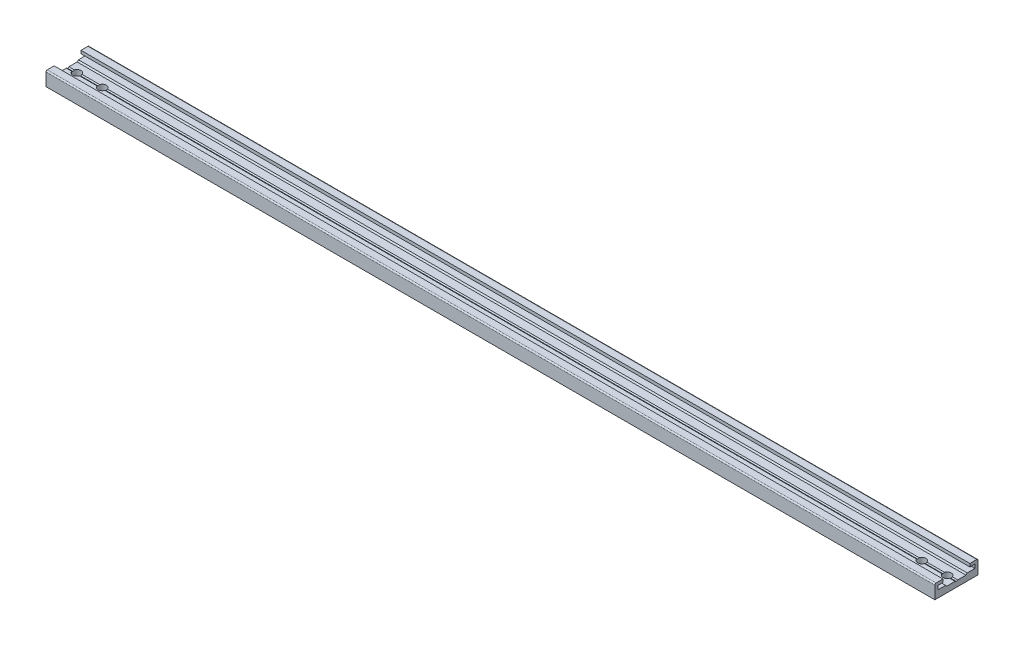
ISO-10303-21;
HEADER;
FILE_DESCRIPTION(('STEP AP214'),'2;1');
FILE_NAME('part.step','',(''),(''),'','','');
FILE_SCHEMA(('AUTOMOTIVE_DESIGN { 1 0 10303 214 1 1 1 1 }'));
ENDSEC;
DATA;
#1=APPLICATION_CONTEXT('core data for automotive mechanical design processes');
#2=APPLICATION_PROTOCOL_DEFINITION('international standard','automotive_design',2000,#1);
#3=PRODUCT_CONTEXT('',#1,'mechanical');
#4=PRODUCT('Part','Part','',(#3));
#5=PRODUCT_RELATED_PRODUCT_CATEGORY('part','',(#4));
#6=PRODUCT_DEFINITION_FORMATION('','',#4);
#7=PRODUCT_DEFINITION_CONTEXT('part definition',#1,'design');
#8=PRODUCT_DEFINITION('design','',#6,#7);
#9=PRODUCT_DEFINITION_SHAPE('','',#8);
#10=(LENGTH_UNIT() NAMED_UNIT(*) SI_UNIT(.MILLI.,.METRE.));
#11=(NAMED_UNIT(*) PLANE_ANGLE_UNIT() SI_UNIT($,.RADIAN.));
#12=(NAMED_UNIT(*) SI_UNIT($,.STERADIAN.) SOLID_ANGLE_UNIT());
#13=UNCERTAINTY_MEASURE_WITH_UNIT(LENGTH_MEASURE(1.E-05),#10,'distance_accuracy_value','');
#14=(GEOMETRIC_REPRESENTATION_CONTEXT(3) GLOBAL_UNCERTAINTY_ASSIGNED_CONTEXT((#13)) GLOBAL_UNIT_ASSIGNED_CONTEXT((#10,
#11,#12)) REPRESENTATION_CONTEXT('',''));
#15=CARTESIAN_POINT('',(0.,0.,0.));
#16=DIRECTION('',(0.,0.,1.));
#17=DIRECTION('',(1.,0.,0.));
#18=AXIS2_PLACEMENT_3D('',#15,#16,#17);
#19=CARTESIAN_POINT('',(350.,-0.45,-0.499999998010386));
#20=DIRECTION('',(0.,-0.866025403784438,-0.500000000000001));
#21=DIRECTION('',(0.,0.500000000000001,-0.866025403784438));
#22=AXIS2_PLACEMENT_3D('',#19,#20,#21);
#23=PLANE('',#22);
#24=DIRECTION('',(-1.,0.,0.));
#25=VECTOR('',#24,1.);
#26=CARTESIAN_POINT('',(350.,-0.45,-0.499999998010386));
#27=LINE('',#26,#25);
#28=CARTESIAN_POINT('',(12.1276315787002,-0.45,-0.499999998010386));
#29=VERTEX_POINT('',#28);
#30=CARTESIAN_POINT('',(5.16736841334154,-0.45,-0.499999998010386));
#31=VERTEX_POINT('',#30);
#32=EDGE_CURVE('E690',#29,#31,#27,.T.);
#33=ORIENTED_EDGE('',*,*,#32,.T.);
#34=CARTESIAN_POINT('',(3.64749999602086,-0.738675131148674,-3.97927575479489E-09));
#35=DIRECTION('',(0.,-0.866025403784438,-0.500000000000001));
#36=DIRECTION('',(0.,0.500000000000001,-0.866025403784438));
#37=AXIS2_PLACEMENT_3D('',#34,#35,#36);
#38=ELLIPSE('',#37,1.8475208614068,1.6);
#39=CARTESIAN_POINT('',(5.24749999602103,-0.738675133446109,0.));
#40=VERTEX_POINT('',#39);
#41=EDGE_CURVE('E444',#31,#40,#38,.T.);
#42=ORIENTED_EDGE('',*,*,#41,.T.);
#43=DIRECTION('',(-1.,0.,0.));
#44=VECTOR('',#43,1.);
#45=CARTESIAN_POINT('',(350.,-0.738675133446109,0.));
#46=LINE('',#45,#44);
#47=CARTESIAN_POINT('',(12.0474999960211,-0.738675133446109,0.));
#48=VERTEX_POINT('',#47);
#49=EDGE_CURVE('E667',#48,#40,#46,.T.);
#50=ORIENTED_EDGE('',*,*,#49,.F.);
#51=CARTESIAN_POINT('',(13.6474999960209,-0.738675131148674,-3.97927453014809E-09));
#52=DIRECTION('',(0.,-0.866025403784438,-0.500000000000001));
#53=DIRECTION('',(0.,0.500000000000001,-0.866025403784438));
#54=AXIS2_PLACEMENT_3D('',#51,#52,#53);
#55=ELLIPSE('',#54,1.84752086140681,1.6);
#56=EDGE_CURVE('E415',#48,#29,#55,.T.);
#57=ORIENTED_EDGE('',*,*,#56,.T.);
#58=EDGE_LOOP('',(#33,#42,#50,#57));
#59=FACE_BOUND('',#58,.T.);
#60=ADVANCED_FACE('F39',(#59),#23,.F.);
#61=CARTESIAN_POINT('',(350.,-0.45,-0.499999998010386));
#62=VERTEX_POINT('',#61);
#63=CARTESIAN_POINT('',(347.8723684213,-0.45,-0.499999998010386));
#64=VERTEX_POINT('',#63);
#65=EDGE_CURVE('E350',#62,#64,#27,.T.);
#66=ORIENTED_EDGE('',*,*,#65,.T.);
#67=CARTESIAN_POINT('',(346.352500003979,-0.738675131148699,-3.97923215399124E-09));
#68=DIRECTION('',(0.,-0.866025403784438,-0.500000000000001));
#69=DIRECTION('',(0.,0.500000000000001,-0.866025403784438));
#70=AXIS2_PLACEMENT_3D('',#67,#68,#69);
#71=ELLIPSE('',#70,1.84752086140676,1.59999999999996);
#72=CARTESIAN_POINT('',(347.952500003979,-0.738675133446109,0.));
#73=VERTEX_POINT('',#72);
#74=EDGE_CURVE('E434',#64,#73,#71,.T.);
#75=ORIENTED_EDGE('',*,*,#74,.T.);
#76=CARTESIAN_POINT('',(350.,-0.738675133446109,0.));
#77=VERTEX_POINT('',#76);
#78=EDGE_CURVE('E345',#77,#73,#46,.T.);
#79=ORIENTED_EDGE('',*,*,#78,.F.);
#80=DIRECTION('',(0.,-0.500000000000001,0.866025403784438));
#81=VECTOR('',#80,1.);
#82=CARTESIAN_POINT('',(350.,-0.45,-0.499999998010386));
#83=LINE('',#82,#81);
#84=EDGE_CURVE('E483',#62,#77,#83,.T.);
#85=ORIENTED_EDGE('',*,*,#84,.F.);
#86=EDGE_LOOP('',(#66,#75,#79,#85));
#87=FACE_BOUND('',#86,.T.);
#88=ADVANCED_FACE('F632',(#87),#23,.F.);
#89=CARTESIAN_POINT('',(344.752500003979,-0.738675133446109,0.));
#90=VERTEX_POINT('',#89);
#91=CARTESIAN_POINT('',(337.952500003979,-0.738675133446109,0.));
#92=VERTEX_POINT('',#91);
#93=EDGE_CURVE('E349',#90,#92,#46,.T.);
#94=ORIENTED_EDGE('',*,*,#93,.F.);
#95=CARTESIAN_POINT('',(344.832631586659,-0.45,-0.499999998010386));
#96=VERTEX_POINT('',#95);
#97=EDGE_CURVE('E439',#90,#96,#71,.T.);
#98=ORIENTED_EDGE('',*,*,#97,.T.);
#99=CARTESIAN_POINT('',(337.8723684213,-0.45,-0.499999998010386));
#100=VERTEX_POINT('',#99);
#101=EDGE_CURVE('E354',#96,#100,#27,.T.);
#102=ORIENTED_EDGE('',*,*,#101,.T.);
#103=CARTESIAN_POINT('',(336.352500003979,-0.738675131148698,-3.97923337863804E-09));
#104=DIRECTION('',(0.,-0.866025403784438,-0.500000000000001));
#105=DIRECTION('',(0.,0.500000000000001,-0.866025403784438));
#106=AXIS2_PLACEMENT_3D('',#103,#104,#105);
#107=ELLIPSE('',#106,1.84752086140676,1.59999999999996);
#108=EDGE_CURVE('E414',#100,#92,#107,.T.);
#109=ORIENTED_EDGE('',*,*,#108,.T.);
#110=EDGE_LOOP('',(#94,#98,#102,#109));
#111=FACE_BOUND('',#110,.T.);
#112=ADVANCED_FACE('F688',(#111),#23,.F.);
#113=CARTESIAN_POINT('',(334.752500003979,-0.738675133446109,0.));
#114=VERTEX_POINT('',#113);
#115=CARTESIAN_POINT('',(15.247499996021,-0.738675133446109,0.));
#116=VERTEX_POINT('',#115);
#117=EDGE_CURVE('E322',#114,#116,#46,.T.);
#118=ORIENTED_EDGE('',*,*,#117,.F.);
#119=CARTESIAN_POINT('',(334.832631586659,-0.45,-0.499999998010386));
#120=VERTEX_POINT('',#119);
#121=EDGE_CURVE('E422',#114,#120,#107,.T.);
#122=ORIENTED_EDGE('',*,*,#121,.T.);
#123=CARTESIAN_POINT('',(15.1673684133415,-0.45,-0.499999998010386));
#124=VERTEX_POINT('',#123);
#125=EDGE_CURVE('E686',#120,#124,#27,.T.);
#126=ORIENTED_EDGE('',*,*,#125,.T.);
#127=EDGE_CURVE('E324',#124,#116,#55,.T.);
#128=ORIENTED_EDGE('',*,*,#127,.T.);
#129=EDGE_LOOP('',(#118,#122,#126,#128));
#130=FACE_BOUND('',#129,.T.);
#131=ADVANCED_FACE('F779',(#130),#23,.F.);
#132=CARTESIAN_POINT('',(350.,-0.45,0.499999998010387));
#133=DIRECTION('',(0.,-0.866025403784438,0.5));
#134=DIRECTION('',(0.,-0.5,-0.866025403784439));
#135=AXIS2_PLACEMENT_3D('',#132,#133,#134);
#136=PLANE('',#135);
#137=DIRECTION('',(-1.,0.,0.));
#138=VECTOR('',#137,1.);
#139=CARTESIAN_POINT('',(350.,-0.45,0.499999998010387));
#140=LINE('',#139,#138);
#141=CARTESIAN_POINT('',(2.12763158131835,-0.450000000000001,0.499999998010387));
#142=VERTEX_POINT('',#141);
#143=CARTESIAN_POINT('',(0.,-0.45,0.499999998010387));
#144=VERTEX_POINT('',#143);
#145=EDGE_CURVE('E338',#142,#144,#140,.T.);
#146=ORIENTED_EDGE('',*,*,#145,.F.);
#147=CARTESIAN_POINT('',(3.64749999602086,-0.738675135743546,-3.97927575479489E-09));
#148=DIRECTION('',(0.,-0.866025403784438,0.5));
#149=DIRECTION('',(0.,0.5,0.866025403784439));
#150=AXIS2_PLACEMENT_3D('',#147,#148,#149);
#151=ELLIPSE('',#150,1.8475208614068,1.6);
#152=CARTESIAN_POINT('',(2.04749999602105,-0.738675133446109,0.));
#153=VERTEX_POINT('',#152);
#154=EDGE_CURVE('E58',#142,#153,#151,.T.);
#155=ORIENTED_EDGE('',*,*,#154,.T.);
#156=CARTESIAN_POINT('',(0.,-0.738675133446109,0.));
#157=VERTEX_POINT('',#156);
#158=EDGE_CURVE('E342',#153,#157,#46,.T.);
#159=ORIENTED_EDGE('',*,*,#158,.T.);
#160=DIRECTION('',(0.,0.5,0.866025403784438));
#161=VECTOR('',#160,1.);
#162=CARTESIAN_POINT('',(0.,-0.45,0.499999998010387));
#163=LINE('',#162,#161);
#164=EDGE_CURVE('E543',#157,#144,#163,.T.);
#165=ORIENTED_EDGE('',*,*,#164,.T.);
#166=EDGE_LOOP('',(#146,#155,#159,#165));
#167=FACE_BOUND('',#166,.T.);
#168=ADVANCED_FACE('F610',(#167),#136,.F.);
#169=CARTESIAN_POINT('',(344.832631589277,-0.450000000000001,0.499999998010387));
#170=VERTEX_POINT('',#169);
#171=CARTESIAN_POINT('',(337.872368418682,-0.45,0.499999998010397));
#172=VERTEX_POINT('',#171);
#173=EDGE_CURVE('E331',#170,#172,#140,.T.);
#174=ORIENTED_EDGE('',*,*,#173,.F.);
#175=CARTESIAN_POINT('',(346.352500003979,-0.73867513574352,-3.97923215399124E-09));
#176=DIRECTION('',(0.,-0.866025403784438,0.5));
#177=DIRECTION('',(0.,0.5,0.866025403784439));
#178=AXIS2_PLACEMENT_3D('',#175,#176,#177);
#179=ELLIPSE('',#178,1.84752086140676,1.59999999999996);
#180=EDGE_CURVE('E408',#170,#90,#179,.T.);
#181=ORIENTED_EDGE('',*,*,#180,.T.);
#182=ORIENTED_EDGE('',*,*,#93,.T.);
#183=CARTESIAN_POINT('',(336.352500003979,-0.738675135743521,-3.97923337863804E-09));
#184=DIRECTION('',(0.,-0.866025403784438,0.5));
#185=DIRECTION('',(0.,0.5,0.866025403784439));
#186=AXIS2_PLACEMENT_3D('',#183,#184,#185);
#187=ELLIPSE('',#186,1.84752086140676,1.59999999999996);
#188=EDGE_CURVE('E410',#92,#172,#187,.T.);
#189=ORIENTED_EDGE('',*,*,#188,.T.);
#190=EDGE_LOOP('',(#174,#181,#182,#189));
#191=FACE_BOUND('',#190,.T.);
#192=ADVANCED_FACE('F406',(#191),#136,.F.);
#193=CARTESIAN_POINT('',(334.832631589277,-0.450000000000001,0.499999998010387));
#194=VERTEX_POINT('',#193);
#195=CARTESIAN_POINT('',(15.1673684107234,-0.45,0.499999998010386));
#196=VERTEX_POINT('',#195);
#197=EDGE_CURVE('E320',#194,#196,#140,.T.);
#198=ORIENTED_EDGE('',*,*,#197,.F.);
#199=EDGE_CURVE('E417',#194,#114,#187,.T.);
#200=ORIENTED_EDGE('',*,*,#199,.T.);
#201=ORIENTED_EDGE('',*,*,#117,.T.);
#202=CARTESIAN_POINT('',(13.6474999960209,-0.738675135743545,-3.97927453014809E-09));
#203=DIRECTION('',(0.,-0.866025403784438,0.5));
#204=DIRECTION('',(0.,0.5,0.866025403784439));
#205=AXIS2_PLACEMENT_3D('',#202,#203,#204);
#206=ELLIPSE('',#205,1.84752086140681,1.6);
#207=EDGE_CURVE('E305',#116,#196,#206,.T.);
#208=ORIENTED_EDGE('',*,*,#207,.T.);
#209=EDGE_LOOP('',(#198,#200,#201,#208));
#210=FACE_BOUND('',#209,.T.);
#211=ADVANCED_FACE('F318',(#210),#136,.F.);
#212=ORIENTED_EDGE('',*,*,#49,.T.);
#213=CARTESIAN_POINT('',(5.16736841072337,-0.45,0.499999998010387));
#214=VERTEX_POINT('',#213);
#215=EDGE_CURVE('E440',#40,#214,#151,.T.);
#216=ORIENTED_EDGE('',*,*,#215,.T.);
#217=CARTESIAN_POINT('',(12.1276315813183,-0.450000000000001,0.499999998010387));
#218=VERTEX_POINT('',#217);
#219=EDGE_CURVE('E332',#218,#214,#140,.T.);
#220=ORIENTED_EDGE('',*,*,#219,.F.);
#221=EDGE_CURVE('E68',#218,#48,#206,.T.);
#222=ORIENTED_EDGE('',*,*,#221,.T.);
#223=EDGE_LOOP('',(#212,#216,#220,#222));
#224=FACE_BOUND('',#223,.T.);
#225=ADVANCED_FACE('F666',(#224),#136,.F.);
#226=CARTESIAN_POINT('',(350.,-2.75,8.49999999602077));
#227=DIRECTION('',(0.,0.,-1.));
#228=DIRECTION('',(0.,1.,0.));
#229=AXIS2_PLACEMENT_3D('',#226,#227,#228);
#230=PLANE('',#229);
#231=DIRECTION('',(0.,-1.,0.));
#232=VECTOR('',#231,1.);
#233=CARTESIAN_POINT('',(0.,-2.75,8.49999999602077));
#234=LINE('',#233,#232);
#235=CARTESIAN_POINT('',(0.,2.25,8.49999999602078));
#236=VERTEX_POINT('',#235);
#237=CARTESIAN_POINT('',(0.,-2.75,8.49999999602077));
#238=VERTEX_POINT('',#237);
#239=EDGE_CURVE('E504',#236,#238,#234,.T.);
#240=ORIENTED_EDGE('',*,*,#239,.T.);
#241=DIRECTION('',(-1.,0.,0.));
#242=VECTOR('',#241,1.);
#243=CARTESIAN_POINT('',(350.,-2.75,8.49999999602077));
#244=LINE('',#243,#242);
#245=CARTESIAN_POINT('',(350.,-2.75,8.49999999602077));
#246=VERTEX_POINT('',#245);
#247=EDGE_CURVE('E313',#246,#238,#244,.T.);
#248=ORIENTED_EDGE('',*,*,#247,.F.);
#249=DIRECTION('',(0.,-1.,0.));
#250=VECTOR('',#249,1.);
#251=CARTESIAN_POINT('',(350.,-2.75,8.49999999602077));
#252=LINE('',#251,#250);
#253=CARTESIAN_POINT('',(350.,2.25,8.49999999602078));
#254=VERTEX_POINT('',#253);
#255=EDGE_CURVE('E449',#254,#246,#252,.T.);
#256=ORIENTED_EDGE('',*,*,#255,.F.);
#257=DIRECTION('',(-1.,0.,0.));
#258=VECTOR('',#257,1.);
#259=CARTESIAN_POINT('',(350.,2.25,8.49999999602078));
#260=LINE('',#259,#258);
#261=EDGE_CURVE('E503',#254,#236,#260,.T.);
#262=ORIENTED_EDGE('',*,*,#261,.T.);
#263=EDGE_LOOP('',(#240,#248,#256,#262));
#264=FACE_BOUND('',#263,.T.);
#265=ADVANCED_FACE('F41',(#264),#230,.F.);
#266=CARTESIAN_POINT('',(350.,-2.75,8.49999999602077));
#267=DIRECTION('',(0.,1.,0.));
#268=DIRECTION('',(0.,0.,1.));
#269=AXIS2_PLACEMENT_3D('',#266,#267,#268);
#270=PLANE('',#269);
#271=CARTESIAN_POINT('',(3.64749999602086,-2.75000000000001,-3.97927655997007E-09));
#272=DIRECTION('',(0.,1.,0.));
#273=DIRECTION('',(0.,0.,1.));
#274=AXIS2_PLACEMENT_3D('',#271,#272,#273);
#275=CIRCLE('',#274,1.6);
#276=CARTESIAN_POINT('',(3.64749999602086,-2.75000000000001,1.59999999602072));
#277=VERTEX_POINT('',#276);
#278=EDGE_CURVE('E659',#277,#277,#275,.T.);
#279=ORIENTED_EDGE('',*,*,#278,.T.);
#280=EDGE_LOOP('',(#279));
#281=FACE_BOUND('',#280,.T.);
#282=CARTESIAN_POINT('',(346.352500003979,-2.75000000000001,-3.97923295916643E-09));
#283=DIRECTION('',(0.,1.,0.));
#284=DIRECTION('',(0.,0.,1.));
#285=AXIS2_PLACEMENT_3D('',#282,#283,#284);
#286=CIRCLE('',#285,1.59999999999996);
#287=CARTESIAN_POINT('',(346.352500003979,-2.75000000000001,1.59999999602073));
#288=VERTEX_POINT('',#287);
#289=EDGE_CURVE('E643',#288,#288,#286,.T.);
#290=ORIENTED_EDGE('',*,*,#289,.T.);
#291=EDGE_LOOP('',(#290));
#292=FACE_BOUND('',#291,.T.);
#293=CARTESIAN_POINT('',(336.352500003979,-2.75000000000001,-3.97923418381323E-09));
#294=DIRECTION('',(0.,1.,0.));
#295=DIRECTION('',(0.,0.,1.));
#296=AXIS2_PLACEMENT_3D('',#293,#294,#295);
#297=CIRCLE('',#296,1.59999999999996);
#298=CARTESIAN_POINT('',(336.352500003979,-2.75000000000001,1.59999999602073));
#299=VERTEX_POINT('',#298);
#300=EDGE_CURVE('E644',#299,#299,#297,.T.);
#301=ORIENTED_EDGE('',*,*,#300,.T.);
#302=EDGE_LOOP('',(#301));
#303=FACE_BOUND('',#302,.T.);
#304=CARTESIAN_POINT('',(13.6474999960209,-2.75000000000001,-3.97927533532328E-09));
#305=DIRECTION('',(0.,1.,0.));
#306=DIRECTION('',(0.,0.,1.));
#307=AXIS2_PLACEMENT_3D('',#304,#305,#306);
#308=CIRCLE('',#307,1.6);
#309=CARTESIAN_POINT('',(13.6474999960209,-2.75000000000001,1.59999999602073));
#310=VERTEX_POINT('',#309);
#311=EDGE_CURVE('E325',#310,#310,#308,.T.);
#312=ORIENTED_EDGE('',*,*,#311,.T.);
#313=EDGE_LOOP('',(#312));
#314=FACE_BOUND('',#313,.T.);
#315=DIRECTION('',(0.,0.,-1.));
#316=VECTOR('',#315,1.);
#317=CARTESIAN_POINT('',(0.,-2.75,8.49999999602077));
#318=LINE('',#317,#316);
#319=CARTESIAN_POINT('',(0.,-2.75,-8.49999999602077));
#320=VERTEX_POINT('',#319);
#321=EDGE_CURVE('E508',#238,#320,#318,.T.);
#322=ORIENTED_EDGE('',*,*,#321,.T.);
#323=DIRECTION('',(-1.,0.,0.));
#324=VECTOR('',#323,1.);
#325=CARTESIAN_POINT('',(350.,-2.75,-8.49999999602077));
#326=LINE('',#325,#324);
#327=CARTESIAN_POINT('',(350.,-2.75,-8.49999999602077));
#328=VERTEX_POINT('',#327);
#329=EDGE_CURVE('E386',#328,#320,#326,.T.);
#330=ORIENTED_EDGE('',*,*,#329,.F.);
#331=DIRECTION('',(0.,0.,-1.));
#332=VECTOR('',#331,1.);
#333=CARTESIAN_POINT('',(350.,-2.75,8.49999999602077));
#334=LINE('',#333,#332);
#335=EDGE_CURVE('E452',#246,#328,#334,.T.);
#336=ORIENTED_EDGE('',*,*,#335,.F.);
#337=ORIENTED_EDGE('',*,*,#247,.T.);
#338=EDGE_LOOP('',(#322,#330,#336,#337));
#339=FACE_BOUND('',#338,.T.);
#340=ADVANCED_FACE('F736',(#281,#292,#303,#314,#339),#270,.F.);
#341=CARTESIAN_POINT('',(350.,-2.75,-8.49999999602077));
#342=DIRECTION('',(0.,0.,1.));
#343=DIRECTION('',(1.,0.,0.));
#344=AXIS2_PLACEMENT_3D('',#341,#342,#343);
#345=PLANE('',#344);
#346=DIRECTION('',(0.,1.,0.));
#347=VECTOR('',#346,1.);
#348=CARTESIAN_POINT('',(0.,-2.75,-8.49999999602077));
#349=LINE('',#348,#347);
#350=CARTESIAN_POINT('',(0.,2.25,-8.49999999602077));
#351=VERTEX_POINT('',#350);
#352=EDGE_CURVE('E511',#320,#351,#349,.T.);
#353=ORIENTED_EDGE('',*,*,#352,.T.);
#354=DIRECTION('',(-1.,0.,0.));
#355=VECTOR('',#354,1.);
#356=CARTESIAN_POINT('',(350.,2.25,-8.49999999602077));
#357=LINE('',#356,#355);
#358=CARTESIAN_POINT('',(350.,2.25,-8.49999999602077));
#359=VERTEX_POINT('',#358);
#360=EDGE_CURVE('E382',#359,#351,#357,.T.);
#361=ORIENTED_EDGE('',*,*,#360,.F.);
#362=DIRECTION('',(0.,1.,0.));
#363=VECTOR('',#362,1.);
#364=CARTESIAN_POINT('',(350.,-2.75,-8.49999999602077));
#365=LINE('',#364,#363);
#366=EDGE_CURVE('E456',#328,#359,#365,.T.);
#367=ORIENTED_EDGE('',*,*,#366,.F.);
#368=ORIENTED_EDGE('',*,*,#329,.T.);
#369=EDGE_LOOP('',(#353,#361,#367,#368));
#370=FACE_BOUND('',#369,.T.);
#371=ADVANCED_FACE('F733',(#370),#345,.F.);
#372=CARTESIAN_POINT('',(350.,2.25,-7.99999999602077));
#373=DIRECTION('',(-1.,0.,0.));
#374=DIRECTION('',(0.,0.,1.));
#375=AXIS2_PLACEMENT_3D('',#372,#373,#374);
#376=CYLINDRICAL_SURFACE('',#375,0.5);
#377=CARTESIAN_POINT('',(0.,2.25,-7.99999999602077));
#378=DIRECTION('',(1.,0.,0.));
#379=DIRECTION('',(0.,0.,-1.));
#380=AXIS2_PLACEMENT_3D('',#377,#378,#379);
#381=CIRCLE('',#380,0.5);
#382=CARTESIAN_POINT('',(0.,2.75,-7.99999999602077));
#383=VERTEX_POINT('',#382);
#384=EDGE_CURVE('E514',#351,#383,#381,.T.);
#385=ORIENTED_EDGE('',*,*,#384,.T.);
#386=DIRECTION('',(-1.,0.,0.));
#387=VECTOR('',#386,1.);
#388=CARTESIAN_POINT('',(350.,2.75,-7.99999999602077));
#389=LINE('',#388,#387);
#390=CARTESIAN_POINT('',(350.,2.75,-7.99999999602077));
#391=VERTEX_POINT('',#390);
#392=EDGE_CURVE('E378',#391,#383,#389,.T.);
#393=ORIENTED_EDGE('',*,*,#392,.F.);
#394=CARTESIAN_POINT('',(350.,2.25,-7.99999999602077));
#395=DIRECTION('',(1.,0.,0.));
#396=DIRECTION('',(0.,0.,-1.));
#397=AXIS2_PLACEMENT_3D('',#394,#395,#396);
#398=CIRCLE('',#397,0.5);
#399=EDGE_CURVE('E459',#359,#391,#398,.T.);
#400=ORIENTED_EDGE('',*,*,#399,.F.);
#401=ORIENTED_EDGE('',*,*,#360,.T.);
#402=EDGE_LOOP('',(#385,#393,#400,#401));
#403=FACE_BOUND('',#402,.T.);
#404=ADVANCED_FACE('F728',(#403),#376,.T.);
#405=CARTESIAN_POINT('',(350.,2.75,-7.99999999602077));
#406=DIRECTION('',(0.,-1.,0.));
#407=DIRECTION('',(0.,0.,-1.));
#408=AXIS2_PLACEMENT_3D('',#405,#406,#407);
#409=PLANE('',#408);
#410=DIRECTION('',(0.,0.,1.));
#411=VECTOR('',#410,1.);
#412=CARTESIAN_POINT('',(0.,2.75,-7.99999999602077));
#413=LINE('',#412,#411);
#414=CARTESIAN_POINT('',(0.,2.75,-5.29999999602078));
#415=VERTEX_POINT('',#414);
#416=EDGE_CURVE('E517',#383,#415,#413,.T.);
#417=ORIENTED_EDGE('',*,*,#416,.T.);
#418=DIRECTION('',(-1.,0.,0.));
#419=VECTOR('',#418,1.);
#420=CARTESIAN_POINT('',(350.,2.75,-5.29999999602078));
#421=LINE('',#420,#419);
#422=CARTESIAN_POINT('',(350.,2.75,-5.29999999602078));
#423=VERTEX_POINT('',#422);
#424=EDGE_CURVE('E374',#423,#415,#421,.T.);
#425=ORIENTED_EDGE('',*,*,#424,.F.);
#426=DIRECTION('',(0.,0.,1.));
#427=VECTOR('',#426,1.);
#428=CARTESIAN_POINT('',(350.,2.75,-7.99999999602077));
#429=LINE('',#428,#427);
#430=EDGE_CURVE('E462',#391,#423,#429,.T.);
#431=ORIENTED_EDGE('',*,*,#430,.F.);
#432=ORIENTED_EDGE('',*,*,#392,.T.);
#433=EDGE_LOOP('',(#417,#425,#431,#432));
#434=FACE_BOUND('',#433,.T.);
#435=ADVANCED_FACE('F723',(#434),#409,.F.);
#436=CARTESIAN_POINT('',(350.,2.75,-5.29999999602078));
#437=DIRECTION('',(0.,0.,-1.));
#438=DIRECTION('',(0.,1.,0.));
#439=AXIS2_PLACEMENT_3D('',#436,#437,#438);
#440=PLANE('',#439);
#441=DIRECTION('',(0.,-1.,0.));
#442=VECTOR('',#441,1.);
#443=CARTESIAN_POINT('',(0.,2.75,-5.29999999602078));
#444=LINE('',#443,#442);
#445=CARTESIAN_POINT('',(0.,1.55,-5.29999999602078));
#446=VERTEX_POINT('',#445);
#447=EDGE_CURVE('E520',#415,#446,#444,.T.);
#448=ORIENTED_EDGE('',*,*,#447,.T.);
#449=DIRECTION('',(-1.,0.,0.));
#450=VECTOR('',#449,1.);
#451=CARTESIAN_POINT('',(350.,1.55,-5.29999999602078));
#452=LINE('',#451,#450);
#453=CARTESIAN_POINT('',(350.,1.55,-5.29999999602078));
#454=VERTEX_POINT('',#453);
#455=EDGE_CURVE('E370',#454,#446,#452,.T.);
#456=ORIENTED_EDGE('',*,*,#455,.F.);
#457=DIRECTION('',(0.,-1.,0.));
#458=VECTOR('',#457,1.);
#459=CARTESIAN_POINT('',(350.,2.75,-5.29999999602078));
#460=LINE('',#459,#458);
#461=EDGE_CURVE('E465',#423,#454,#460,.T.);
#462=ORIENTED_EDGE('',*,*,#461,.F.);
#463=ORIENTED_EDGE('',*,*,#424,.T.);
#464=EDGE_LOOP('',(#448,#456,#462,#463));
#465=FACE_BOUND('',#464,.T.);
#466=ADVANCED_FACE('F719',(#465),#440,.F.);
#467=CARTESIAN_POINT('',(350.,1.55,-5.29999999602078));
#468=DIRECTION('',(0.,1.,0.));
#469=DIRECTION('',(0.,0.,1.));
#470=AXIS2_PLACEMENT_3D('',#467,#468,#469);
#471=PLANE('',#470);
#472=DIRECTION('',(0.,0.,-1.));
#473=VECTOR('',#472,1.);
#474=CARTESIAN_POINT('',(0.,1.55,-5.29999999602078));
#475=LINE('',#474,#473);
#476=CARTESIAN_POINT('',(0.,1.55,-7.29999999801039));
#477=VERTEX_POINT('',#476);
#478=EDGE_CURVE('E523',#446,#477,#475,.T.);
#479=ORIENTED_EDGE('',*,*,#478,.T.);
#480=DIRECTION('',(-1.,0.,0.));
#481=VECTOR('',#480,1.);
#482=CARTESIAN_POINT('',(350.,1.55,-7.29999999801039));
#483=LINE('',#482,#481);
#484=CARTESIAN_POINT('',(350.,1.55,-7.29999999801039));
#485=VERTEX_POINT('',#484);
#486=EDGE_CURVE('E366',#485,#477,#483,.T.);
#487=ORIENTED_EDGE('',*,*,#486,.F.);
#488=DIRECTION('',(0.,0.,-1.));
#489=VECTOR('',#488,1.);
#490=CARTESIAN_POINT('',(350.,1.55,-5.29999999602078));
#491=LINE('',#490,#489);
#492=EDGE_CURVE('E468',#454,#485,#491,.T.);
#493=ORIENTED_EDGE('',*,*,#492,.F.);
#494=ORIENTED_EDGE('',*,*,#455,.T.);
#495=EDGE_LOOP('',(#479,#487,#493,#494));
#496=FACE_BOUND('',#495,.T.);
#497=ADVANCED_FACE('F714',(#496),#471,.F.);
#498=CARTESIAN_POINT('',(350.,1.55,-7.29999999801039));
#499=DIRECTION('',(0.,0.,-1.));
#500=DIRECTION('',(0.,1.,0.));
#501=AXIS2_PLACEMENT_3D('',#498,#499,#500);
#502=PLANE('',#501);
#503=DIRECTION('',(0.,-1.,0.));
#504=VECTOR('',#503,1.);
#505=CARTESIAN_POINT('',(0.,1.55,-7.29999999801039));
#506=LINE('',#505,#504);
#507=CARTESIAN_POINT('',(0.,0.0500000000000036,-7.29999999801039));
#508=VERTEX_POINT('',#507);
#509=EDGE_CURVE('E526',#477,#508,#506,.T.);
#510=ORIENTED_EDGE('',*,*,#509,.T.);
#511=DIRECTION('',(-1.,0.,0.));
#512=VECTOR('',#511,1.);
#513=CARTESIAN_POINT('',(350.,0.0500000000000036,-7.29999999801039));
#514=LINE('',#513,#512);
#515=CARTESIAN_POINT('',(350.,0.0500000000000036,-7.29999999801039));
#516=VERTEX_POINT('',#515);
#517=EDGE_CURVE('E362',#516,#508,#514,.T.);
#518=ORIENTED_EDGE('',*,*,#517,.F.);
#519=DIRECTION('',(0.,-1.,0.));
#520=VECTOR('',#519,1.);
#521=CARTESIAN_POINT('',(350.,1.55,-7.29999999801039));
#522=LINE('',#521,#520);
#523=EDGE_CURVE('E471',#485,#516,#522,.T.);
#524=ORIENTED_EDGE('',*,*,#523,.F.);
#525=ORIENTED_EDGE('',*,*,#486,.T.);
#526=EDGE_LOOP('',(#510,#518,#524,#525));
#527=FACE_BOUND('',#526,.T.);
#528=ADVANCED_FACE('F708',(#527),#502,.F.);
#529=CARTESIAN_POINT('',(350.,0.0500000000000036,-7.29999999801039));
#530=DIRECTION('',(0.,-1.,0.));
#531=DIRECTION('',(0.,0.,-1.));
#532=AXIS2_PLACEMENT_3D('',#529,#530,#531);
#533=PLANE('',#532);
#534=DIRECTION('',(0.,0.,1.));
#535=VECTOR('',#534,1.);
#536=CARTESIAN_POINT('',(0.,0.0500000000000036,-7.29999999801039));
#537=LINE('',#536,#535);
#538=CARTESIAN_POINT('',(0.,0.0500000000000001,-4.24999999801039));
#539=VERTEX_POINT('',#538);
#540=EDGE_CURVE('E529',#508,#539,#537,.T.);
#541=ORIENTED_EDGE('',*,*,#540,.T.);
#542=DIRECTION('',(-1.,0.,0.));
#543=VECTOR('',#542,1.);
#544=CARTESIAN_POINT('',(350.,0.0500000000000001,-4.24999999801039));
#545=LINE('',#544,#543);
#546=CARTESIAN_POINT('',(350.,0.0500000000000001,-4.24999999801039));
#547=VERTEX_POINT('',#546);
#548=EDGE_CURVE('E358',#547,#539,#545,.T.);
#549=ORIENTED_EDGE('',*,*,#548,.F.);
#550=DIRECTION('',(0.,0.,1.));
#551=VECTOR('',#550,1.);
#552=CARTESIAN_POINT('',(350.,0.0500000000000036,-7.29999999801039));
#553=LINE('',#552,#551);
#554=EDGE_CURVE('E474',#516,#547,#553,.T.);
#555=ORIENTED_EDGE('',*,*,#554,.F.);
#556=ORIENTED_EDGE('',*,*,#517,.T.);
#557=EDGE_LOOP('',(#541,#549,#555,#556));
#558=FACE_BOUND('',#557,.T.);
#559=ADVANCED_FACE('F704',(#558),#533,.F.);
#560=CARTESIAN_POINT('',(350.,0.0500000000000001,-4.24999999801039));
#561=DIRECTION('',(0.,-0.707106781186547,-0.707106781186547));
#562=DIRECTION('',(0.,0.707106781186548,-0.707106781186548));
#563=AXIS2_PLACEMENT_3D('',#560,#561,#562);
#564=PLANE('',#563);
#565=DIRECTION('',(0.,-0.707106781186548,0.707106781186548));
#566=VECTOR('',#565,1.);
#567=CARTESIAN_POINT('',(0.,0.0500000000000001,-4.24999999801039));
#568=LINE('',#567,#566);
#569=CARTESIAN_POINT('',(0.,-0.45,-3.74999999801039));
#570=VERTEX_POINT('',#569);
#571=EDGE_CURVE('E532',#539,#570,#568,.T.);
#572=ORIENTED_EDGE('',*,*,#571,.T.);
#573=DIRECTION('',(-1.,0.,0.));
#574=VECTOR('',#573,1.);
#575=CARTESIAN_POINT('',(350.,-0.45,-3.74999999801039));
#576=LINE('',#575,#574);
#577=CARTESIAN_POINT('',(350.,-0.45,-3.74999999801039));
#578=VERTEX_POINT('',#577);
#579=EDGE_CURVE('E353',#578,#570,#576,.T.);
#580=ORIENTED_EDGE('',*,*,#579,.F.);
#581=DIRECTION('',(0.,-0.707106781186548,0.707106781186548));
#582=VECTOR('',#581,1.);
#583=CARTESIAN_POINT('',(350.,0.0500000000000001,-4.24999999801039));
#584=LINE('',#583,#582);
#585=EDGE_CURVE('E477',#547,#578,#584,.T.);
#586=ORIENTED_EDGE('',*,*,#585,.F.);
#587=ORIENTED_EDGE('',*,*,#548,.T.);
#588=EDGE_LOOP('',(#572,#580,#586,#587));
#589=FACE_BOUND('',#588,.T.);
#590=ADVANCED_FACE('F699',(#589),#564,.F.);
#591=CARTESIAN_POINT('',(350.,-0.45,-3.74999999801039));
#592=DIRECTION('',(0.,-1.,0.));
#593=DIRECTION('',(0.,0.,-1.));
#594=AXIS2_PLACEMENT_3D('',#591,#592,#593);
#595=PLANE('',#594);
#596=CARTESIAN_POINT('',(2.12763157870017,-0.45,-0.499999998010386));
#597=VERTEX_POINT('',#596);
#598=CARTESIAN_POINT('',(0.,-0.45,-0.499999998010386));
#599=VERTEX_POINT('',#598);
#600=EDGE_CURVE('E348',#597,#599,#27,.T.);
#601=ORIENTED_EDGE('',*,*,#600,.F.);
#602=CARTESIAN_POINT('',(3.64749999602086,-0.45,-3.97927563923223E-09));
#603=DIRECTION('',(0.,1.,0.));
#604=DIRECTION('',(0.,0.,1.));
#605=AXIS2_PLACEMENT_3D('',#602,#603,#604);
#606=CIRCLE('',#605,1.6);
#607=EDGE_CURVE('E647',#31,#597,#606,.T.);
#608=ORIENTED_EDGE('',*,*,#607,.F.);
#609=ORIENTED_EDGE('',*,*,#32,.F.);
#610=CARTESIAN_POINT('',(13.6474999960209,-0.45,-3.97927441458543E-09));
#611=DIRECTION('',(0.,1.,0.));
#612=DIRECTION('',(0.,0.,1.));
#613=AXIS2_PLACEMENT_3D('',#610,#611,#612);
#614=CIRCLE('',#613,1.6);
#615=EDGE_CURVE('E657',#124,#29,#614,.T.);
#616=ORIENTED_EDGE('',*,*,#615,.F.);
#617=ORIENTED_EDGE('',*,*,#125,.F.);
#618=CARTESIAN_POINT('',(336.352500003979,-0.45,-3.97923326307538E-09));
#619=DIRECTION('',(0.,1.,0.));
#620=DIRECTION('',(0.,0.,1.));
#621=AXIS2_PLACEMENT_3D('',#618,#619,#620);
#622=CIRCLE('',#621,1.59999999999996);
#623=EDGE_CURVE('E650',#100,#120,#622,.T.);
#624=ORIENTED_EDGE('',*,*,#623,.F.);
#625=ORIENTED_EDGE('',*,*,#101,.F.);
#626=CARTESIAN_POINT('',(346.352500003979,-0.45,-3.97923203842858E-09));
#627=DIRECTION('',(0.,1.,0.));
#628=DIRECTION('',(0.,0.,1.));
#629=AXIS2_PLACEMENT_3D('',#626,#627,#628);
#630=CIRCLE('',#629,1.59999999999996);
#631=EDGE_CURVE('E639',#64,#96,#630,.T.);
#632=ORIENTED_EDGE('',*,*,#631,.F.);
#633=ORIENTED_EDGE('',*,*,#65,.F.);
#634=DIRECTION('',(0.,0.,1.));
#635=VECTOR('',#634,1.);
#636=CARTESIAN_POINT('',(350.,-0.45,-3.74999999801039));
#637=LINE('',#636,#635);
#638=EDGE_CURVE('E480',#578,#62,#637,.T.);
#639=ORIENTED_EDGE('',*,*,#638,.F.);
#640=ORIENTED_EDGE('',*,*,#579,.T.);
#641=DIRECTION('',(0.,0.,1.));
#642=VECTOR('',#641,1.);
#643=CARTESIAN_POINT('',(0.,-0.45,-3.74999999801039));
#644=LINE('',#643,#642);
#645=EDGE_CURVE('E535',#570,#599,#644,.T.);
#646=ORIENTED_EDGE('',*,*,#645,.T.);
#647=EDGE_LOOP('',(#601,#608,#609,#616,#617,#624,#625,#632,#633,#639,#640,#646));
#648=FACE_BOUND('',#647,.T.);
#649=ADVANCED_FACE('F637',(#648),#595,.F.);
#650=ORIENTED_EDGE('',*,*,#158,.F.);
#651=EDGE_CURVE('E448',#153,#597,#38,.T.);
#652=ORIENTED_EDGE('',*,*,#651,.T.);
#653=ORIENTED_EDGE('',*,*,#600,.T.);
#654=DIRECTION('',(0.,-0.500000000000001,0.866025403784438));
#655=VECTOR('',#654,1.);
#656=CARTESIAN_POINT('',(0.,-0.45,-0.499999998010386));
#657=LINE('',#656,#655);
#658=EDGE_CURVE('E539',#599,#157,#657,.T.);
#659=ORIENTED_EDGE('',*,*,#658,.T.);
#660=EDGE_LOOP('',(#650,#652,#653,#659));
#661=FACE_BOUND('',#660,.T.);
#662=ADVANCED_FACE('F692',(#661),#23,.F.);
#663=ORIENTED_EDGE('',*,*,#78,.T.);
#664=CARTESIAN_POINT('',(347.872368418682,-0.45,0.499999998010397));
#665=VERTEX_POINT('',#664);
#666=EDGE_CURVE('E430',#73,#665,#179,.T.);
#667=ORIENTED_EDGE('',*,*,#666,.T.);
#668=CARTESIAN_POINT('',(350.,-0.45,0.499999998010387));
#669=VERTEX_POINT('',#668);
#670=EDGE_CURVE('E336',#669,#665,#140,.T.);
#671=ORIENTED_EDGE('',*,*,#670,.F.);
#672=DIRECTION('',(0.,0.5,0.866025403784438));
#673=VECTOR('',#672,1.);
#674=CARTESIAN_POINT('',(350.,-0.45,0.499999998010387));
#675=LINE('',#674,#673);
#676=EDGE_CURVE('E485',#77,#669,#675,.T.);
#677=ORIENTED_EDGE('',*,*,#676,.F.);
#678=EDGE_LOOP('',(#663,#667,#671,#677));
#679=FACE_BOUND('',#678,.T.);
#680=ADVANCED_FACE('F628',(#679),#136,.F.);
#681=CARTESIAN_POINT('',(350.,-0.450000000000002,3.74999999801039));
#682=DIRECTION('',(0.,-1.,0.));
#683=DIRECTION('',(0.,0.,-1.));
#684=AXIS2_PLACEMENT_3D('',#681,#682,#683);
#685=PLANE('',#684);
#686=ORIENTED_EDGE('',*,*,#219,.T.);
#687=CARTESIAN_POINT('',(3.64749999602086,-0.45,-3.97927563923223E-09));
#688=DIRECTION('',(0.,-1.,0.));
#689=DIRECTION('',(0.,0.,-1.));
#690=AXIS2_PLACEMENT_3D('',#687,#688,#689);
#691=CIRCLE('',#690,1.6);
#692=EDGE_CURVE('E11',#214,#142,#691,.T.);
#693=ORIENTED_EDGE('',*,*,#692,.T.);
#694=ORIENTED_EDGE('',*,*,#145,.T.);
#695=DIRECTION('',(0.,0.,1.));
#696=VECTOR('',#695,1.);
#697=CARTESIAN_POINT('',(0.,-0.450000000000002,3.74999999801039));
#698=LINE('',#697,#696);
#699=CARTESIAN_POINT('',(0.,-0.450000000000002,3.74999999801039));
#700=VERTEX_POINT('',#699);
#701=EDGE_CURVE('E547',#144,#700,#698,.T.);
#702=ORIENTED_EDGE('',*,*,#701,.T.);
#703=DIRECTION('',(-1.,0.,0.));
#704=VECTOR('',#703,1.);
#705=CARTESIAN_POINT('',(350.,-0.450000000000002,3.74999999801039));
#706=LINE('',#705,#704);
#707=CARTESIAN_POINT('',(350.,-0.450000000000002,3.74999999801039));
#708=VERTEX_POINT('',#707);
#709=EDGE_CURVE('E343',#708,#700,#706,.T.);
#710=ORIENTED_EDGE('',*,*,#709,.F.);
#711=DIRECTION('',(0.,0.,1.));
#712=VECTOR('',#711,1.);
#713=CARTESIAN_POINT('',(350.,-0.450000000000002,3.74999999801039));
#714=LINE('',#713,#712);
#715=EDGE_CURVE('E487',#669,#708,#714,.T.);
#716=ORIENTED_EDGE('',*,*,#715,.F.);
#717=ORIENTED_EDGE('',*,*,#670,.T.);
#718=CARTESIAN_POINT('',(346.352500003979,-0.45,-3.97923203842858E-09));
#719=DIRECTION('',(0.,-1.,0.));
#720=DIRECTION('',(0.,0.,-1.));
#721=AXIS2_PLACEMENT_3D('',#718,#719,#720);
#722=CIRCLE('',#721,1.59999999999996);
#723=EDGE_CURVE('E48',#665,#170,#722,.T.);
#724=ORIENTED_EDGE('',*,*,#723,.T.);
#725=ORIENTED_EDGE('',*,*,#173,.T.);
#726=CARTESIAN_POINT('',(336.352500003979,-0.45,-3.97923326307538E-09));
#727=DIRECTION('',(0.,-1.,0.));
#728=DIRECTION('',(0.,0.,-1.));
#729=AXIS2_PLACEMENT_3D('',#726,#727,#728);
#730=CIRCLE('',#729,1.59999999999996);
#731=EDGE_CURVE('E312',#172,#194,#730,.T.);
#732=ORIENTED_EDGE('',*,*,#731,.T.);
#733=ORIENTED_EDGE('',*,*,#197,.T.);
#734=CARTESIAN_POINT('',(13.6474999960209,-0.45,-3.97927441458543E-09));
#735=DIRECTION('',(0.,-1.,0.));
#736=DIRECTION('',(0.,0.,-1.));
#737=AXIS2_PLACEMENT_3D('',#734,#735,#736);
#738=CIRCLE('',#737,1.6);
#739=EDGE_CURVE('E302',#196,#218,#738,.T.);
#740=ORIENTED_EDGE('',*,*,#739,.T.);
#741=EDGE_LOOP('',(#686,#693,#694,#702,#710,#716,#717,#724,#725,#732,#733,#740));
#742=FACE_BOUND('',#741,.T.);
#743=ADVANCED_FACE('F328',(#742),#685,.F.);
#744=CARTESIAN_POINT('',(350.,0.0499999999999984,4.24999999801039));
#745=DIRECTION('',(0.,-0.707106781186548,0.707106781186547));
#746=DIRECTION('',(0.,-0.707106781186547,-0.707106781186548));
#747=AXIS2_PLACEMENT_3D('',#744,#745,#746);
#748=PLANE('',#747);
#749=DIRECTION('',(0.,0.707106781186547,0.707106781186548));
#750=VECTOR('',#749,1.);
#751=CARTESIAN_POINT('',(0.,0.0499999999999984,4.24999999801039));
#752=LINE('',#751,#750);
#753=CARTESIAN_POINT('',(0.,0.0499999999999984,4.24999999801039));
#754=VERTEX_POINT('',#753);
#755=EDGE_CURVE('E549',#700,#754,#752,.T.);
#756=ORIENTED_EDGE('',*,*,#755,.T.);
#757=DIRECTION('',(-1.,0.,0.));
#758=VECTOR('',#757,1.);
#759=CARTESIAN_POINT('',(350.,0.0499999999999984,4.24999999801039));
#760=LINE('',#759,#758);
#761=CARTESIAN_POINT('',(350.,0.0499999999999984,4.24999999801039));
#762=VERTEX_POINT('',#761);
#763=EDGE_CURVE('E591',#762,#754,#760,.T.);
#764=ORIENTED_EDGE('',*,*,#763,.F.);
#765=DIRECTION('',(0.,0.707106781186547,0.707106781186548));
#766=VECTOR('',#765,1.);
#767=CARTESIAN_POINT('',(350.,0.0499999999999984,4.24999999801039));
#768=LINE('',#767,#766);
#769=EDGE_CURVE('E489',#708,#762,#768,.T.);
#770=ORIENTED_EDGE('',*,*,#769,.F.);
#771=ORIENTED_EDGE('',*,*,#709,.T.);
#772=EDGE_LOOP('',(#756,#764,#770,#771));
#773=FACE_BOUND('',#772,.T.);
#774=ADVANCED_FACE('F617',(#773),#748,.F.);
#775=CARTESIAN_POINT('',(350.,0.050000000000001,7.29999999801039));
#776=DIRECTION('',(0.,-1.,0.));
#777=DIRECTION('',(0.,0.,-1.));
#778=AXIS2_PLACEMENT_3D('',#775,#776,#777);
#779=PLANE('',#778);
#780=DIRECTION('',(0.,0.,1.));
#781=VECTOR('',#780,1.);
#782=CARTESIAN_POINT('',(0.,0.050000000000001,7.29999999801039));
#783=LINE('',#782,#781);
#784=CARTESIAN_POINT('',(0.,0.050000000000001,7.29999999801039));
#785=VERTEX_POINT('',#784);
#786=EDGE_CURVE('E552',#754,#785,#783,.T.);
#787=ORIENTED_EDGE('',*,*,#786,.T.);
#788=DIRECTION('',(-1.,0.,0.));
#789=VECTOR('',#788,1.);
#790=CARTESIAN_POINT('',(350.,0.050000000000001,7.29999999801039));
#791=LINE('',#790,#789);
#792=CARTESIAN_POINT('',(350.,0.050000000000001,7.29999999801039));
#793=VERTEX_POINT('',#792);
#794=EDGE_CURVE('E588',#793,#785,#791,.T.);
#795=ORIENTED_EDGE('',*,*,#794,.F.);
#796=DIRECTION('',(0.,0.,1.));
#797=VECTOR('',#796,1.);
#798=CARTESIAN_POINT('',(350.,0.050000000000001,7.29999999801039));
#799=LINE('',#798,#797);
#800=EDGE_CURVE('E491',#762,#793,#799,.T.);
#801=ORIENTED_EDGE('',*,*,#800,.F.);
#802=ORIENTED_EDGE('',*,*,#763,.T.);
#803=EDGE_LOOP('',(#787,#795,#801,#802));
#804=FACE_BOUND('',#803,.T.);
#805=ADVANCED_FACE('F619',(#804),#779,.F.);
#806=CARTESIAN_POINT('',(350.,1.55,7.29999999801039));
#807=DIRECTION('',(0.,0.,1.));
#808=DIRECTION('',(0.,-1.,0.));
#809=AXIS2_PLACEMENT_3D('',#806,#807,#808);
#810=PLANE('',#809);
#811=DIRECTION('',(0.,1.,0.));
#812=VECTOR('',#811,1.);
#813=CARTESIAN_POINT('',(0.,1.55,7.29999999801039));
#814=LINE('',#813,#812);
#815=CARTESIAN_POINT('',(0.,1.55,7.29999999801039));
#816=VERTEX_POINT('',#815);
#817=EDGE_CURVE('E555',#785,#816,#814,.T.);
#818=ORIENTED_EDGE('',*,*,#817,.T.);
#819=DIRECTION('',(-1.,0.,0.));
#820=VECTOR('',#819,1.);
#821=CARTESIAN_POINT('',(350.,1.55,7.29999999801039));
#822=LINE('',#821,#820);
#823=CARTESIAN_POINT('',(350.,1.55,7.29999999801039));
#824=VERTEX_POINT('',#823);
#825=EDGE_CURVE('E584',#824,#816,#822,.T.);
#826=ORIENTED_EDGE('',*,*,#825,.F.);
#827=DIRECTION('',(0.,1.,0.));
#828=VECTOR('',#827,1.);
#829=CARTESIAN_POINT('',(350.,1.55,7.29999999801039));
#830=LINE('',#829,#828);
#831=EDGE_CURVE('E493',#793,#824,#830,.T.);
#832=ORIENTED_EDGE('',*,*,#831,.F.);
#833=ORIENTED_EDGE('',*,*,#794,.T.);
#834=EDGE_LOOP('',(#818,#826,#832,#833));
#835=FACE_BOUND('',#834,.T.);
#836=ADVANCED_FACE('F761',(#835),#810,.F.);
#837=CARTESIAN_POINT('',(350.,1.55,5.29999999602078));
#838=DIRECTION('',(0.,1.,0.));
#839=DIRECTION('',(0.,0.,1.));
#840=AXIS2_PLACEMENT_3D('',#837,#838,#839);
#841=PLANE('',#840);
#842=DIRECTION('',(0.,0.,-1.));
#843=VECTOR('',#842,1.);
#844=CARTESIAN_POINT('',(0.,1.55,5.29999999602078));
#845=LINE('',#844,#843);
#846=CARTESIAN_POINT('',(0.,1.55,5.29999999602078));
#847=VERTEX_POINT('',#846);
#848=EDGE_CURVE('E558',#816,#847,#845,.T.);
#849=ORIENTED_EDGE('',*,*,#848,.T.);
#850=DIRECTION('',(-1.,0.,0.));
#851=VECTOR('',#850,1.);
#852=CARTESIAN_POINT('',(350.,1.55,5.29999999602078));
#853=LINE('',#852,#851);
#854=CARTESIAN_POINT('',(350.,1.55,5.29999999602078));
#855=VERTEX_POINT('',#854);
#856=EDGE_CURVE('E580',#855,#847,#853,.T.);
#857=ORIENTED_EDGE('',*,*,#856,.F.);
#858=DIRECTION('',(0.,0.,-1.));
#859=VECTOR('',#858,1.);
#860=CARTESIAN_POINT('',(350.,1.55,5.29999999602078));
#861=LINE('',#860,#859);
#862=EDGE_CURVE('E495',#824,#855,#861,.T.);
#863=ORIENTED_EDGE('',*,*,#862,.F.);
#864=ORIENTED_EDGE('',*,*,#825,.T.);
#865=EDGE_LOOP('',(#849,#857,#863,#864));
#866=FACE_BOUND('',#865,.T.);
#867=ADVANCED_FACE('F759',(#866),#841,.F.);
#868=CARTESIAN_POINT('',(350.,2.75,5.29999999602078));
#869=DIRECTION('',(0.,0.,1.));
#870=DIRECTION('',(0.,-1.,0.));
#871=AXIS2_PLACEMENT_3D('',#868,#869,#870);
#872=PLANE('',#871);
#873=DIRECTION('',(0.,1.,0.));
#874=VECTOR('',#873,1.);
#875=CARTESIAN_POINT('',(0.,2.75,5.29999999602078));
#876=LINE('',#875,#874);
#877=CARTESIAN_POINT('',(0.,2.75,5.29999999602078));
#878=VERTEX_POINT('',#877);
#879=EDGE_CURVE('E561',#847,#878,#876,.T.);
#880=ORIENTED_EDGE('',*,*,#879,.T.);
#881=DIRECTION('',(-1.,0.,0.));
#882=VECTOR('',#881,1.);
#883=CARTESIAN_POINT('',(350.,2.75,5.29999999602078));
#884=LINE('',#883,#882);
#885=CARTESIAN_POINT('',(350.,2.75,5.29999999602078));
#886=VERTEX_POINT('',#885);
#887=EDGE_CURVE('E576',#886,#878,#884,.T.);
#888=ORIENTED_EDGE('',*,*,#887,.F.);
#889=DIRECTION('',(0.,1.,0.));
#890=VECTOR('',#889,1.);
#891=CARTESIAN_POINT('',(350.,2.75,5.29999999602078));
#892=LINE('',#891,#890);
#893=EDGE_CURVE('E497',#855,#886,#892,.T.);
#894=ORIENTED_EDGE('',*,*,#893,.F.);
#895=ORIENTED_EDGE('',*,*,#856,.T.);
#896=EDGE_LOOP('',(#880,#888,#894,#895));
#897=FACE_BOUND('',#896,.T.);
#898=ADVANCED_FACE('F754',(#897),#872,.F.);
#899=CARTESIAN_POINT('',(350.,2.75,7.99999999602078));
#900=DIRECTION('',(0.,-1.,0.));
#901=DIRECTION('',(0.,0.,-1.));
#902=AXIS2_PLACEMENT_3D('',#899,#900,#901);
#903=PLANE('',#902);
#904=DIRECTION('',(0.,0.,1.));
#905=VECTOR('',#904,1.);
#906=CARTESIAN_POINT('',(0.,2.75,7.99999999602078));
#907=LINE('',#906,#905);
#908=CARTESIAN_POINT('',(0.,2.75,7.99999999602078));
#909=VERTEX_POINT('',#908);
#910=EDGE_CURVE('E564',#878,#909,#907,.T.);
#911=ORIENTED_EDGE('',*,*,#910,.T.);
#912=DIRECTION('',(-1.,0.,0.));
#913=VECTOR('',#912,1.);
#914=CARTESIAN_POINT('',(350.,2.75,7.99999999602078));
#915=LINE('',#914,#913);
#916=CARTESIAN_POINT('',(350.,2.75,7.99999999602078));
#917=VERTEX_POINT('',#916);
#918=EDGE_CURVE('E572',#917,#909,#915,.T.);
#919=ORIENTED_EDGE('',*,*,#918,.F.);
#920=DIRECTION('',(0.,0.,1.));
#921=VECTOR('',#920,1.);
#922=CARTESIAN_POINT('',(350.,2.75,7.99999999602078));
#923=LINE('',#922,#921);
#924=EDGE_CURVE('E499',#886,#917,#923,.T.);
#925=ORIENTED_EDGE('',*,*,#924,.F.);
#926=ORIENTED_EDGE('',*,*,#887,.T.);
#927=EDGE_LOOP('',(#911,#919,#925,#926));
#928=FACE_BOUND('',#927,.T.);
#929=ADVANCED_FACE('F749',(#928),#903,.F.);
#930=CARTESIAN_POINT('',(350.,2.25,7.99999999602078));
#931=DIRECTION('',(-1.,0.,0.));
#932=DIRECTION('',(0.,0.,1.));
#933=AXIS2_PLACEMENT_3D('',#930,#931,#932);
#934=CYLINDRICAL_SURFACE('',#933,0.5);
#935=CARTESIAN_POINT('',(0.,2.25,7.99999999602078));
#936=DIRECTION('',(1.,0.,0.));
#937=DIRECTION('',(0.,0.,-1.));
#938=AXIS2_PLACEMENT_3D('',#935,#936,#937);
#939=CIRCLE('',#938,0.5);
#940=EDGE_CURVE('E453',#909,#236,#939,.T.);
#941=ORIENTED_EDGE('',*,*,#940,.T.);
#942=ORIENTED_EDGE('',*,*,#261,.F.);
#943=CARTESIAN_POINT('',(350.,2.25,7.99999999602078));
#944=DIRECTION('',(1.,0.,0.));
#945=DIRECTION('',(0.,0.,-1.));
#946=AXIS2_PLACEMENT_3D('',#943,#944,#945);
#947=CIRCLE('',#946,0.5);
#948=EDGE_CURVE('E501',#917,#254,#947,.T.);
#949=ORIENTED_EDGE('',*,*,#948,.F.);
#950=ORIENTED_EDGE('',*,*,#918,.T.);
#951=EDGE_LOOP('',(#941,#942,#949,#950));
#952=FACE_BOUND('',#951,.T.);
#953=ADVANCED_FACE('F745',(#952),#934,.T.);
#954=CARTESIAN_POINT('',(350.,2.25,7.99999999602078));
#955=DIRECTION('',(1.,0.,0.));
#956=DIRECTION('',(0.,0.,-1.));
#957=AXIS2_PLACEMENT_3D('',#954,#955,#956);
#958=PLANE('',#957);
#959=ORIENTED_EDGE('',*,*,#255,.T.);
#960=ORIENTED_EDGE('',*,*,#335,.T.);
#961=ORIENTED_EDGE('',*,*,#366,.T.);
#962=ORIENTED_EDGE('',*,*,#399,.T.);
#963=ORIENTED_EDGE('',*,*,#430,.T.);
#964=ORIENTED_EDGE('',*,*,#461,.T.);
#965=ORIENTED_EDGE('',*,*,#492,.T.);
#966=ORIENTED_EDGE('',*,*,#523,.T.);
#967=ORIENTED_EDGE('',*,*,#554,.T.);
#968=ORIENTED_EDGE('',*,*,#585,.T.);
#969=ORIENTED_EDGE('',*,*,#638,.T.);
#970=ORIENTED_EDGE('',*,*,#84,.T.);
#971=ORIENTED_EDGE('',*,*,#676,.T.);
#972=ORIENTED_EDGE('',*,*,#715,.T.);
#973=ORIENTED_EDGE('',*,*,#769,.T.);
#974=ORIENTED_EDGE('',*,*,#800,.T.);
#975=ORIENTED_EDGE('',*,*,#831,.T.);
#976=ORIENTED_EDGE('',*,*,#862,.T.);
#977=ORIENTED_EDGE('',*,*,#893,.T.);
#978=ORIENTED_EDGE('',*,*,#924,.T.);
#979=ORIENTED_EDGE('',*,*,#948,.T.);
#980=EDGE_LOOP('',(#959,#960,#961,#962,#963,#964,#965,#966,#967,#968,#969,#970,#971,#972,#973,
#974,#975,#976,#977,#978,#979));
#981=FACE_BOUND('',#980,.T.);
#982=ADVANCED_FACE('F622',(#981),#958,.T.);
#983=CARTESIAN_POINT('',(0.,2.25,7.99999999602078));
#984=DIRECTION('',(1.,0.,0.));
#985=DIRECTION('',(0.,0.,-1.));
#986=AXIS2_PLACEMENT_3D('',#983,#984,#985);
#987=PLANE('',#986);
#988=ORIENTED_EDGE('',*,*,#239,.F.);
#989=ORIENTED_EDGE('',*,*,#940,.F.);
#990=ORIENTED_EDGE('',*,*,#910,.F.);
#991=ORIENTED_EDGE('',*,*,#879,.F.);
#992=ORIENTED_EDGE('',*,*,#848,.F.);
#993=ORIENTED_EDGE('',*,*,#817,.F.);
#994=ORIENTED_EDGE('',*,*,#786,.F.);
#995=ORIENTED_EDGE('',*,*,#755,.F.);
#996=ORIENTED_EDGE('',*,*,#701,.F.);
#997=ORIENTED_EDGE('',*,*,#164,.F.);
#998=ORIENTED_EDGE('',*,*,#658,.F.);
#999=ORIENTED_EDGE('',*,*,#645,.F.);
#1000=ORIENTED_EDGE('',*,*,#571,.F.);
#1001=ORIENTED_EDGE('',*,*,#540,.F.);
#1002=ORIENTED_EDGE('',*,*,#509,.F.);
#1003=ORIENTED_EDGE('',*,*,#478,.F.);
#1004=ORIENTED_EDGE('',*,*,#447,.F.);
#1005=ORIENTED_EDGE('',*,*,#416,.F.);
#1006=ORIENTED_EDGE('',*,*,#384,.F.);
#1007=ORIENTED_EDGE('',*,*,#352,.F.);
#1008=ORIENTED_EDGE('',*,*,#321,.F.);
#1009=EDGE_LOOP('',(#988,#989,#990,#991,#992,#993,#994,#995,#996,#997,#998,#999,#1000,#1001,
#1002,#1003,#1004,#1005,#1006,#1007,#1008));
#1010=FACE_BOUND('',#1009,.T.);
#1011=ADVANCED_FACE('F615',(#1010),#987,.F.);
#1012=CARTESIAN_POINT('',(13.6474999960209,-2.75000000000001,-3.97927533532328E-09));
#1013=DIRECTION('',(0.,1.,0.));
#1014=DIRECTION('',(0.,0.,1.));
#1015=AXIS2_PLACEMENT_3D('',#1012,#1013,#1014);
#1016=CYLINDRICAL_SURFACE('',#1015,1.6);
#1017=ORIENTED_EDGE('',*,*,#311,.F.);
#1018=EDGE_LOOP('',(#1017));
#1019=FACE_BOUND('',#1018,.T.);
#1020=ORIENTED_EDGE('',*,*,#221,.F.);
#1021=ORIENTED_EDGE('',*,*,#739,.F.);
#1022=ORIENTED_EDGE('',*,*,#207,.F.);
#1023=ORIENTED_EDGE('',*,*,#127,.F.);
#1024=ORIENTED_EDGE('',*,*,#615,.T.);
#1025=ORIENTED_EDGE('',*,*,#56,.F.);
#1026=EDGE_LOOP('',(#1020,#1021,#1022,#1023,#1024,#1025));
#1027=FACE_BOUND('',#1026,.T.);
#1028=ADVANCED_FACE('F304',(#1019,#1027),#1016,.F.);
#1029=CARTESIAN_POINT('',(336.352500003979,-2.75000000000001,-3.97923418381323E-09));
#1030=DIRECTION('',(0.,1.,0.));
#1031=DIRECTION('',(0.,0.,1.));
#1032=AXIS2_PLACEMENT_3D('',#1029,#1030,#1031);
#1033=CYLINDRICAL_SURFACE('',#1032,1.59999999999996);
#1034=ORIENTED_EDGE('',*,*,#300,.F.);
#1035=EDGE_LOOP('',(#1034));
#1036=FACE_BOUND('',#1035,.T.);
#1037=ORIENTED_EDGE('',*,*,#199,.F.);
#1038=ORIENTED_EDGE('',*,*,#731,.F.);
#1039=ORIENTED_EDGE('',*,*,#188,.F.);
#1040=ORIENTED_EDGE('',*,*,#108,.F.);
#1041=ORIENTED_EDGE('',*,*,#623,.T.);
#1042=ORIENTED_EDGE('',*,*,#121,.F.);
#1043=EDGE_LOOP('',(#1037,#1038,#1039,#1040,#1041,#1042));
#1044=FACE_BOUND('',#1043,.T.);
#1045=ADVANCED_FACE('F684',(#1036,#1044),#1033,.F.);
#1046=CARTESIAN_POINT('',(346.352500003979,-2.75000000000001,-3.97923295916643E-09));
#1047=DIRECTION('',(0.,1.,0.));
#1048=DIRECTION('',(0.,0.,1.));
#1049=AXIS2_PLACEMENT_3D('',#1046,#1047,#1048);
#1050=CYLINDRICAL_SURFACE('',#1049,1.59999999999996);
#1051=ORIENTED_EDGE('',*,*,#289,.F.);
#1052=EDGE_LOOP('',(#1051));
#1053=FACE_BOUND('',#1052,.T.);
#1054=ORIENTED_EDGE('',*,*,#180,.F.);
#1055=ORIENTED_EDGE('',*,*,#723,.F.);
#1056=ORIENTED_EDGE('',*,*,#666,.F.);
#1057=ORIENTED_EDGE('',*,*,#74,.F.);
#1058=ORIENTED_EDGE('',*,*,#631,.T.);
#1059=ORIENTED_EDGE('',*,*,#97,.F.);
#1060=EDGE_LOOP('',(#1054,#1055,#1056,#1057,#1058,#1059));
#1061=FACE_BOUND('',#1060,.T.);
#1062=ADVANCED_FACE('F629',(#1053,#1061),#1050,.F.);
#1063=CARTESIAN_POINT('',(3.64749999602086,-2.75000000000001,-3.97927655997007E-09));
#1064=DIRECTION('',(0.,1.,0.));
#1065=DIRECTION('',(0.,0.,1.));
#1066=AXIS2_PLACEMENT_3D('',#1063,#1064,#1065);
#1067=CYLINDRICAL_SURFACE('',#1066,1.6);
#1068=ORIENTED_EDGE('',*,*,#278,.F.);
#1069=EDGE_LOOP('',(#1068));
#1070=FACE_BOUND('',#1069,.T.);
#1071=ORIENTED_EDGE('',*,*,#154,.F.);
#1072=ORIENTED_EDGE('',*,*,#692,.F.);
#1073=ORIENTED_EDGE('',*,*,#215,.F.);
#1074=ORIENTED_EDGE('',*,*,#41,.F.);
#1075=ORIENTED_EDGE('',*,*,#607,.T.);
#1076=ORIENTED_EDGE('',*,*,#651,.F.);
#1077=EDGE_LOOP('',(#1071,#1072,#1073,#1074,#1075,#1076));
#1078=FACE_BOUND('',#1077,.T.);
#1079=ADVANCED_FACE('F829',(#1070,#1078),#1067,.F.);
#1080=CLOSED_SHELL('',(#60,#88,#112,#131,#168,#192,#211,#225,#265,#340,#371,#404,#435,#466,#497,
#528,#559,#590,#649,#662,#680,#743,#774,#805,#836,#867,#898,#929,#953,#982,#1011,#1028,#1045,
#1062,#1079));
#1081=MANIFOLD_SOLID_BREP('B2',#1080);
#1082=ADVANCED_BREP_SHAPE_REPRESENTATION('',(#18,#1081),#14);
#1083=SHAPE_DEFINITION_REPRESENTATION(#9,#1082);
ENDSEC;
END-ISO-10303-21;
